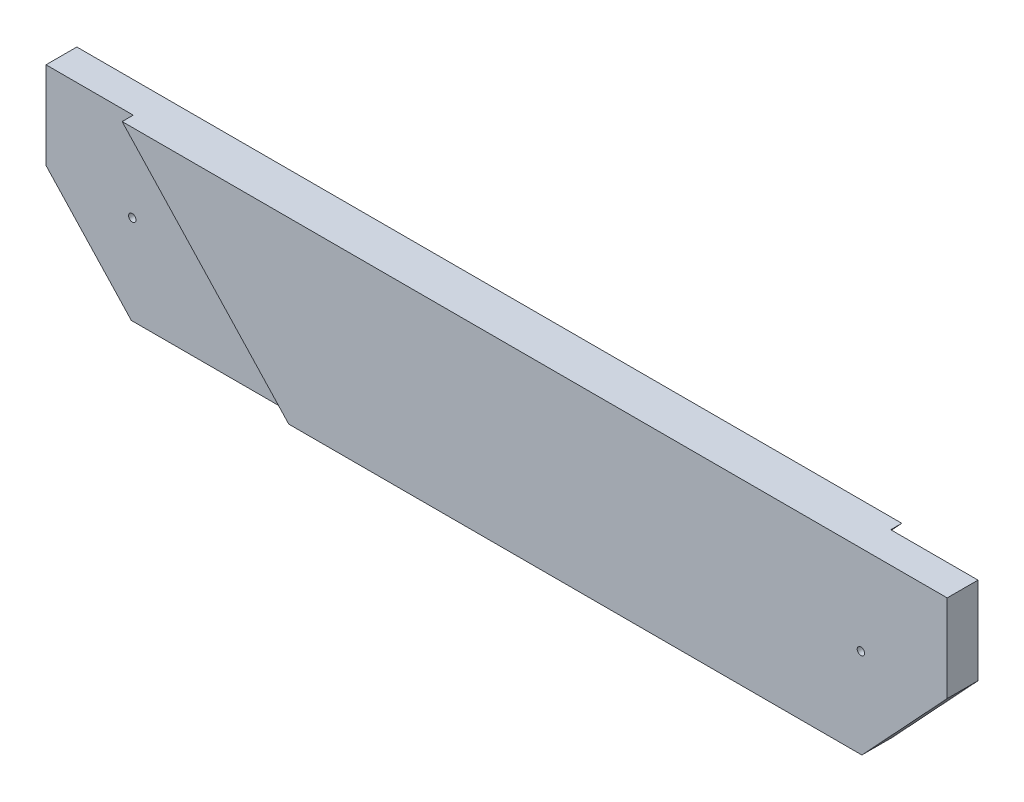
ISO-10303-21;
HEADER;
FILE_DESCRIPTION(('STEP AP214'),'2;1');
FILE_NAME('part.step','',(''),(''),'','','');
FILE_SCHEMA(('AUTOMOTIVE_DESIGN { 1 0 10303 214 1 1 1 1 }'));
ENDSEC;
DATA;
#1=APPLICATION_CONTEXT('core data for automotive mechanical design processes');
#2=APPLICATION_PROTOCOL_DEFINITION('international standard','automotive_design',2000,#1);
#3=PRODUCT_CONTEXT('',#1,'mechanical');
#4=PRODUCT('Part','Part','',(#3));
#5=PRODUCT_RELATED_PRODUCT_CATEGORY('part','',(#4));
#6=PRODUCT_DEFINITION_FORMATION('','',#4);
#7=PRODUCT_DEFINITION_CONTEXT('part definition',#1,'design');
#8=PRODUCT_DEFINITION('design','',#6,#7);
#9=PRODUCT_DEFINITION_SHAPE('','',#8);
#10=(LENGTH_UNIT() NAMED_UNIT(*) SI_UNIT(.MILLI.,.METRE.));
#11=(NAMED_UNIT(*) PLANE_ANGLE_UNIT() SI_UNIT($,.RADIAN.));
#12=(NAMED_UNIT(*) SI_UNIT($,.STERADIAN.) SOLID_ANGLE_UNIT());
#13=UNCERTAINTY_MEASURE_WITH_UNIT(LENGTH_MEASURE(1.E-05),#10,'distance_accuracy_value','');
#14=(GEOMETRIC_REPRESENTATION_CONTEXT(3) GLOBAL_UNCERTAINTY_ASSIGNED_CONTEXT((#13)) GLOBAL_UNIT_ASSIGNED_CONTEXT((#10,
#11,#12)) REPRESENTATION_CONTEXT('',''));
#15=CARTESIAN_POINT('',(0.,0.,0.));
#16=DIRECTION('',(0.,0.,1.));
#17=DIRECTION('',(1.,0.,0.));
#18=AXIS2_PLACEMENT_3D('',#15,#16,#17);
#19=CARTESIAN_POINT('',(370.,72.5,34.));
#20=DIRECTION('',(-1.,0.,0.));
#21=DIRECTION('',(0.,-1.,0.));
#22=AXIS2_PLACEMENT_3D('',#19,#20,#21);
#23=PLANE('',#22);
#24=DIRECTION('',(0.,0.,-1.));
#25=VECTOR('',#24,1.);
#26=CARTESIAN_POINT('',(370.,1.76955905067835,34.));
#27=LINE('',#26,#25);
#28=CARTESIAN_POINT('',(370.,1.76955905067835,34.));
#29=VERTEX_POINT('',#28);
#30=CARTESIAN_POINT('',(370.,1.76955905067835,9.));
#31=VERTEX_POINT('',#30);
#32=EDGE_CURVE('E175',#29,#31,#27,.T.);
#33=ORIENTED_EDGE('',*,*,#32,.T.);
#34=DIRECTION('',(0.,1.,0.));
#35=VECTOR('',#34,1.);
#36=CARTESIAN_POINT('',(370.,72.5,9.));
#37=LINE('',#36,#35);
#38=CARTESIAN_POINT('',(370.,72.5,9.));
#39=VERTEX_POINT('',#38);
#40=EDGE_CURVE('E54',#31,#39,#37,.T.);
#41=ORIENTED_EDGE('',*,*,#40,.T.);
#42=DIRECTION('',(0.,0.,-1.));
#43=VECTOR('',#42,1.);
#44=CARTESIAN_POINT('',(370.,72.5,34.));
#45=LINE('',#44,#43);
#46=CARTESIAN_POINT('',(370.,72.5,34.));
#47=VERTEX_POINT('',#46);
#48=EDGE_CURVE('E154',#47,#39,#45,.T.);
#49=ORIENTED_EDGE('',*,*,#48,.F.);
#50=DIRECTION('',(0.,1.,0.));
#51=VECTOR('',#50,1.);
#52=CARTESIAN_POINT('',(370.,72.5,34.));
#53=LINE('',#52,#51);
#54=EDGE_CURVE('E142',#29,#47,#53,.T.);
#55=ORIENTED_EDGE('',*,*,#54,.F.);
#56=EDGE_LOOP('',(#33,#41,#49,#55));
#57=FACE_BOUND('',#56,.T.);
#58=ADVANCED_FACE('F40',(#57),#23,.F.);
#59=CARTESIAN_POINT('',(-370.,72.5,34.));
#60=DIRECTION('',(0.,-1.,0.));
#61=DIRECTION('',(0.,0.,-1.));
#62=AXIS2_PLACEMENT_3D('',#59,#60,#61);
#63=PLANE('',#62);
#64=DIRECTION('',(-1.,0.,0.));
#65=VECTOR('',#64,1.);
#66=CARTESIAN_POINT('',(-370.,72.5,9.));
#67=LINE('',#66,#65);
#68=CARTESIAN_POINT('',(299.223287792499,72.5,9.));
#69=VERTEX_POINT('',#68);
#70=EDGE_CURVE('E184',#39,#69,#67,.T.);
#71=ORIENTED_EDGE('',*,*,#70,.T.);
#72=DIRECTION('',(0.,0.,-1.));
#73=VECTOR('',#72,1.);
#74=CARTESIAN_POINT('',(299.223287792499,72.5,34.));
#75=LINE('',#74,#73);
#76=CARTESIAN_POINT('',(299.223287792499,72.5,0.));
#77=VERTEX_POINT('',#76);
#78=EDGE_CURVE('E125',#69,#77,#75,.T.);
#79=ORIENTED_EDGE('',*,*,#78,.T.);
#80=DIRECTION('',(-1.,0.,0.));
#81=VECTOR('',#80,1.);
#82=CARTESIAN_POINT('',(-370.,72.5,0.));
#83=LINE('',#82,#81);
#84=CARTESIAN_POINT('',(-370.,72.5,0.));
#85=VERTEX_POINT('',#84);
#86=EDGE_CURVE('E135',#77,#85,#83,.T.);
#87=ORIENTED_EDGE('',*,*,#86,.T.);
#88=DIRECTION('',(0.,0.,-1.));
#89=VECTOR('',#88,1.);
#90=CARTESIAN_POINT('',(-370.,72.5,34.));
#91=LINE('',#90,#89);
#92=CARTESIAN_POINT('',(-370.,72.5,25.));
#93=VERTEX_POINT('',#92);
#94=EDGE_CURVE('E151',#93,#85,#91,.T.);
#95=ORIENTED_EDGE('',*,*,#94,.F.);
#96=DIRECTION('',(1.,0.,0.));
#97=VECTOR('',#96,1.);
#98=CARTESIAN_POINT('',(-370.,72.5,25.));
#99=LINE('',#98,#97);
#100=CARTESIAN_POINT('',(-299.223287792498,72.5,25.));
#101=VERTEX_POINT('',#100);
#102=EDGE_CURVE('E196',#93,#101,#99,.T.);
#103=ORIENTED_EDGE('',*,*,#102,.T.);
#104=DIRECTION('',(0.,0.,1.));
#105=VECTOR('',#104,1.);
#106=CARTESIAN_POINT('',(-299.223287792498,72.5,34.));
#107=LINE('',#106,#105);
#108=CARTESIAN_POINT('',(-299.223287792498,72.5,34.));
#109=VERTEX_POINT('',#108);
#110=EDGE_CURVE('E168',#101,#109,#107,.T.);
#111=ORIENTED_EDGE('',*,*,#110,.T.);
#112=DIRECTION('',(-1.,0.,0.));
#113=VECTOR('',#112,1.);
#114=CARTESIAN_POINT('',(-370.,72.5,34.));
#115=LINE('',#114,#113);
#116=EDGE_CURVE('E145',#47,#109,#115,.T.);
#117=ORIENTED_EDGE('',*,*,#116,.F.);
#118=ORIENTED_EDGE('',*,*,#48,.T.);
#119=EDGE_LOOP('',(#71,#79,#87,#95,#103,#111,#117,#118));
#120=FACE_BOUND('',#119,.T.);
#121=ADVANCED_FACE('F182',(#120),#63,.F.);
#122=CARTESIAN_POINT('',(-370.,72.5,34.));
#123=DIRECTION('',(1.,0.,0.));
#124=DIRECTION('',(0.,0.,-1.));
#125=AXIS2_PLACEMENT_3D('',#122,#123,#124);
#126=PLANE('',#125);
#127=DIRECTION('',(0.,0.,-1.));
#128=VECTOR('',#127,1.);
#129=CARTESIAN_POINT('',(-370.,1.76955905067837,34.));
#130=LINE('',#129,#128);
#131=CARTESIAN_POINT('',(-370.,1.76955905067837,25.));
#132=VERTEX_POINT('',#131);
#133=CARTESIAN_POINT('',(-370.,1.76955905067837,0.));
#134=VERTEX_POINT('',#133);
#135=EDGE_CURVE('E160',#132,#134,#130,.T.);
#136=ORIENTED_EDGE('',*,*,#135,.F.);
#137=DIRECTION('',(0.,1.,0.));
#138=VECTOR('',#137,1.);
#139=CARTESIAN_POINT('',(-370.,72.5,25.));
#140=LINE('',#139,#138);
#141=EDGE_CURVE('E61',#132,#93,#140,.T.);
#142=ORIENTED_EDGE('',*,*,#141,.T.);
#143=ORIENTED_EDGE('',*,*,#94,.T.);
#144=DIRECTION('',(0.,-1.,0.));
#145=VECTOR('',#144,1.);
#146=CARTESIAN_POINT('',(-370.,72.5,0.));
#147=LINE('',#146,#145);
#148=EDGE_CURVE('E143',#85,#134,#147,.T.);
#149=ORIENTED_EDGE('',*,*,#148,.T.);
#150=EDGE_LOOP('',(#136,#142,#143,#149));
#151=FACE_BOUND('',#150,.T.);
#152=ADVANCED_FACE('F162',(#151),#126,.F.);
#153=CARTESIAN_POINT('',(-370.,-72.5,34.));
#154=DIRECTION('',(0.,1.,0.));
#155=DIRECTION('',(0.,0.,1.));
#156=AXIS2_PLACEMENT_3D('',#153,#154,#155);
#157=PLANE('',#156);
#158=DIRECTION('',(1.,0.,0.));
#159=VECTOR('',#158,1.);
#160=CARTESIAN_POINT('',(-370.,-72.5,0.));
#161=LINE('',#160,#159);
#162=CARTESIAN_POINT('',(-300.776712207501,-72.5,0.));
#163=VERTEX_POINT('',#162);
#164=CARTESIAN_POINT('',(164.075363687237,-72.5,0.));
#165=VERTEX_POINT('',#164);
#166=EDGE_CURVE('E133',#163,#165,#161,.T.);
#167=ORIENTED_EDGE('',*,*,#166,.T.);
#168=DIRECTION('',(0.,0.,1.));
#169=VECTOR('',#168,1.);
#170=CARTESIAN_POINT('',(164.075363687238,-72.5,34.));
#171=LINE('',#170,#169);
#172=CARTESIAN_POINT('',(164.075363687237,-72.5,9.));
#173=VERTEX_POINT('',#172);
#174=EDGE_CURVE('E115',#165,#173,#171,.T.);
#175=ORIENTED_EDGE('',*,*,#174,.T.);
#176=DIRECTION('',(1.,0.,0.));
#177=VECTOR('',#176,1.);
#178=CARTESIAN_POINT('',(-370.,-72.5,9.));
#179=LINE('',#178,#177);
#180=CARTESIAN_POINT('',(300.776712207502,-72.5,9.));
#181=VERTEX_POINT('',#180);
#182=EDGE_CURVE('E217',#173,#181,#179,.T.);
#183=ORIENTED_EDGE('',*,*,#182,.T.);
#184=DIRECTION('',(0.,0.,-1.));
#185=VECTOR('',#184,1.);
#186=CARTESIAN_POINT('',(300.776712207502,-72.5,34.));
#187=LINE('',#186,#185);
#188=CARTESIAN_POINT('',(300.776712207502,-72.5,34.));
#189=VERTEX_POINT('',#188);
#190=EDGE_CURVE('E208',#189,#181,#187,.T.);
#191=ORIENTED_EDGE('',*,*,#190,.F.);
#192=DIRECTION('',(1.,0.,0.));
#193=VECTOR('',#192,1.);
#194=CARTESIAN_POINT('',(-370.,-72.5,34.));
#195=LINE('',#194,#193);
#196=CARTESIAN_POINT('',(-164.075363687237,-72.5,34.));
#197=VERTEX_POINT('',#196);
#198=EDGE_CURVE('E155',#197,#189,#195,.T.);
#199=ORIENTED_EDGE('',*,*,#198,.F.);
#200=DIRECTION('',(0.,0.,-1.));
#201=VECTOR('',#200,1.);
#202=CARTESIAN_POINT('',(-164.075363687237,-72.5,34.));
#203=LINE('',#202,#201);
#204=CARTESIAN_POINT('',(-164.075363687237,-72.5,25.));
#205=VERTEX_POINT('',#204);
#206=EDGE_CURVE('E201',#197,#205,#203,.T.);
#207=ORIENTED_EDGE('',*,*,#206,.T.);
#208=DIRECTION('',(-1.,0.,0.));
#209=VECTOR('',#208,1.);
#210=CARTESIAN_POINT('',(-370.,-72.5,25.));
#211=LINE('',#210,#209);
#212=CARTESIAN_POINT('',(-300.776712207501,-72.5,25.));
#213=VERTEX_POINT('',#212);
#214=EDGE_CURVE('E192',#205,#213,#211,.T.);
#215=ORIENTED_EDGE('',*,*,#214,.T.);
#216=DIRECTION('',(0.,0.,-1.));
#217=VECTOR('',#216,1.);
#218=CARTESIAN_POINT('',(-300.776712207501,-72.5,34.));
#219=LINE('',#218,#217);
#220=EDGE_CURVE('E140',#213,#163,#219,.T.);
#221=ORIENTED_EDGE('',*,*,#220,.T.);
#222=EDGE_LOOP('',(#167,#175,#183,#191,#199,#207,#215,#221));
#223=FACE_BOUND('',#222,.T.);
#224=ADVANCED_FACE('F137',(#223),#157,.F.);
#225=CARTESIAN_POINT('',(0.,0.,34.));
#226=DIRECTION('',(0.,0.,1.));
#227=DIRECTION('',(1.,0.,0.));
#228=AXIS2_PLACEMENT_3D('',#225,#226,#227);
#229=PLANE('',#228);
#230=DIRECTION('',(-0.681818181818182,0.731521679065049,0.));
#231=VECTOR('',#230,1.);
#232=CARTESIAN_POINT('',(-337.944791383867,114.044241673852,34.));
#233=LINE('',#232,#231);
#234=EDGE_CURVE('E185',#197,#109,#233,.T.);
#235=ORIENTED_EDGE('',*,*,#234,.F.);
#236=ORIENTED_EDGE('',*,*,#198,.T.);
#237=DIRECTION('',(0.681818181818182,0.731521679065049,0.));
#238=VECTOR('',#237,1.);
#239=CARTESIAN_POINT('',(370.,1.76955905067835,34.));
#240=LINE('',#239,#238);
#241=EDGE_CURVE('E166',#189,#29,#240,.T.);
#242=ORIENTED_EDGE('',*,*,#241,.T.);
#243=ORIENTED_EDGE('',*,*,#54,.T.);
#244=ORIENTED_EDGE('',*,*,#116,.T.);
#245=EDGE_LOOP('',(#235,#236,#242,#243,#244));
#246=FACE_BOUND('',#245,.T.);
#247=CARTESIAN_POINT('',(300.,0.,34.));
#248=DIRECTION('',(0.,0.,-1.));
#249=DIRECTION('',(-1.,0.,0.));
#250=AXIS2_PLACEMENT_3D('',#247,#248,#249);
#251=CIRCLE('',#250,2.99999999999999);
#252=CARTESIAN_POINT('',(297.,0.,34.));
#253=VERTEX_POINT('',#252);
#254=EDGE_CURVE('E171',#253,#253,#251,.T.);
#255=ORIENTED_EDGE('',*,*,#254,.T.);
#256=EDGE_LOOP('',(#255));
#257=FACE_BOUND('',#256,.T.);
#258=ADVANCED_FACE('F234',(#246,#257),#229,.T.);
#259=CARTESIAN_POINT('',(0.,0.,0.));
#260=DIRECTION('',(0.,0.,1.));
#261=DIRECTION('',(1.,0.,0.));
#262=AXIS2_PLACEMENT_3D('',#259,#260,#261);
#263=PLANE('',#262);
#264=CARTESIAN_POINT('',(-300.,0.,0.));
#265=DIRECTION('',(0.,0.,1.));
#266=DIRECTION('',(1.,0.,0.));
#267=AXIS2_PLACEMENT_3D('',#264,#265,#266);
#268=CIRCLE('',#267,2.99999999999999);
#269=CARTESIAN_POINT('',(-297.,0.,0.));
#270=VERTEX_POINT('',#269);
#271=EDGE_CURVE('E174',#270,#270,#268,.T.);
#272=ORIENTED_EDGE('',*,*,#271,.T.);
#273=EDGE_LOOP('',(#272));
#274=FACE_BOUND('',#273,.T.);
#275=ORIENTED_EDGE('',*,*,#86,.F.);
#276=DIRECTION('',(0.681818181818182,0.731521679065049,0.));
#277=VECTOR('',#276,1.);
#278=CARTESIAN_POINT('',(361.833214072471,139.674093651081,0.));
#279=LINE('',#278,#277);
#280=EDGE_CURVE('E118',#165,#77,#279,.T.);
#281=ORIENTED_EDGE('',*,*,#280,.F.);
#282=ORIENTED_EDGE('',*,*,#166,.F.);
#283=DIRECTION('',(0.681818181818181,-0.73152167906505,0.));
#284=VECTOR('',#283,1.);
#285=CARTESIAN_POINT('',(-300.776712207501,-72.5,0.));
#286=LINE('',#285,#284);
#287=EDGE_CURVE('E164',#134,#163,#286,.T.);
#288=ORIENTED_EDGE('',*,*,#287,.F.);
#289=ORIENTED_EDGE('',*,*,#148,.F.);
#290=EDGE_LOOP('',(#275,#281,#282,#288,#289));
#291=FACE_BOUND('',#290,.T.);
#292=ADVANCED_FACE('F131',(#274,#291),#263,.F.);
#293=CARTESIAN_POINT('',(-300.,0.,0.));
#294=DIRECTION('',(0.,0.,1.));
#295=DIRECTION('',(1.,0.,0.));
#296=AXIS2_PLACEMENT_3D('',#293,#294,#295);
#297=CYLINDRICAL_SURFACE('',#296,2.99999999999999);
#298=CARTESIAN_POINT('',(-300.,0.,25.));
#299=DIRECTION('',(0.,0.,-1.));
#300=DIRECTION('',(-1.,0.,0.));
#301=AXIS2_PLACEMENT_3D('',#298,#299,#300);
#302=CIRCLE('',#301,2.99999999999999);
#303=CARTESIAN_POINT('',(-303.,0.,25.));
#304=VERTEX_POINT('',#303);
#305=EDGE_CURVE('E198',#304,#304,#302,.F.);
#306=ORIENTED_EDGE('',*,*,#305,.T.);
#307=EDGE_LOOP('',(#306));
#308=FACE_BOUND('',#307,.T.);
#309=ORIENTED_EDGE('',*,*,#271,.F.);
#310=EDGE_LOOP('',(#309));
#311=FACE_BOUND('',#310,.T.);
#312=ADVANCED_FACE('F230',(#308,#311),#297,.F.);
#313=CARTESIAN_POINT('',(300.,0.,0.));
#314=DIRECTION('',(0.,0.,1.));
#315=DIRECTION('',(1.,0.,0.));
#316=AXIS2_PLACEMENT_3D('',#313,#314,#315);
#317=CYLINDRICAL_SURFACE('',#316,2.99999999999999);
#318=CARTESIAN_POINT('',(300.,0.,9.));
#319=DIRECTION('',(0.,0.,1.));
#320=DIRECTION('',(1.,0.,0.));
#321=AXIS2_PLACEMENT_3D('',#318,#319,#320);
#322=CIRCLE('',#321,2.99999999999999);
#323=CARTESIAN_POINT('',(303.,0.,9.));
#324=VERTEX_POINT('',#323);
#325=EDGE_CURVE('E126',#324,#324,#322,.T.);
#326=ORIENTED_EDGE('',*,*,#325,.F.);
#327=EDGE_LOOP('',(#326));
#328=FACE_BOUND('',#327,.T.);
#329=ORIENTED_EDGE('',*,*,#254,.F.);
#330=EDGE_LOOP('',(#329));
#331=FACE_BOUND('',#330,.T.);
#332=ADVANCED_FACE('F227',(#328,#331),#317,.F.);
#333=CARTESIAN_POINT('',(-300.776712207501,-72.5,34.));
#334=DIRECTION('',(0.73152167906505,0.681818181818181,0.));
#335=DIRECTION('',(-0.681818181818181,0.73152167906505,0.));
#336=AXIS2_PLACEMENT_3D('',#333,#334,#335);
#337=PLANE('',#336);
#338=ORIENTED_EDGE('',*,*,#220,.F.);
#339=DIRECTION('',(-0.681818181818181,0.73152167906505,0.));
#340=VECTOR('',#339,1.);
#341=CARTESIAN_POINT('',(-300.776712207501,-72.5,25.));
#342=LINE('',#341,#340);
#343=EDGE_CURVE('E47',#213,#132,#342,.T.);
#344=ORIENTED_EDGE('',*,*,#343,.T.);
#345=ORIENTED_EDGE('',*,*,#135,.T.);
#346=ORIENTED_EDGE('',*,*,#287,.T.);
#347=EDGE_LOOP('',(#338,#344,#345,#346));
#348=FACE_BOUND('',#347,.T.);
#349=ADVANCED_FACE('F159',(#348),#337,.F.);
#350=CARTESIAN_POINT('',(370.,1.76955905067835,34.));
#351=DIRECTION('',(-0.731521679065049,0.681818181818182,0.));
#352=DIRECTION('',(-0.681818181818182,-0.731521679065049,0.));
#353=AXIS2_PLACEMENT_3D('',#350,#351,#352);
#354=PLANE('',#353);
#355=ORIENTED_EDGE('',*,*,#190,.T.);
#356=DIRECTION('',(0.681818181818182,0.731521679065049,0.));
#357=VECTOR('',#356,1.);
#358=CARTESIAN_POINT('',(370.,1.76955905067835,9.));
#359=LINE('',#358,#357);
#360=EDGE_CURVE('E11',#181,#31,#359,.T.);
#361=ORIENTED_EDGE('',*,*,#360,.T.);
#362=ORIENTED_EDGE('',*,*,#32,.F.);
#363=ORIENTED_EDGE('',*,*,#241,.F.);
#364=EDGE_LOOP('',(#355,#361,#362,#363));
#365=FACE_BOUND('',#364,.T.);
#366=ADVANCED_FACE('F215',(#365),#354,.F.);
#367=CARTESIAN_POINT('',(-337.944791383867,114.044241673852,25.));
#368=DIRECTION('',(0.731521679065049,0.681818181818182,0.));
#369=DIRECTION('',(-0.681818181818182,0.731521679065049,0.));
#370=AXIS2_PLACEMENT_3D('',#367,#368,#369);
#371=PLANE('',#370);
#372=DIRECTION('',(-0.681818181818182,0.731521679065049,0.));
#373=VECTOR('',#372,1.);
#374=CARTESIAN_POINT('',(-337.944791383867,114.044241673852,25.));
#375=LINE('',#374,#373);
#376=EDGE_CURVE('E187',#205,#101,#375,.T.);
#377=ORIENTED_EDGE('',*,*,#376,.F.);
#378=ORIENTED_EDGE('',*,*,#206,.F.);
#379=ORIENTED_EDGE('',*,*,#234,.T.);
#380=ORIENTED_EDGE('',*,*,#110,.F.);
#381=EDGE_LOOP('',(#377,#378,#379,#380));
#382=FACE_BOUND('',#381,.T.);
#383=ADVANCED_FACE('F260',(#382),#371,.F.);
#384=CARTESIAN_POINT('',(0.,0.,25.));
#385=DIRECTION('',(0.,0.,-1.));
#386=DIRECTION('',(-1.,0.,0.));
#387=AXIS2_PLACEMENT_3D('',#384,#385,#386);
#388=PLANE('',#387);
#389=ORIENTED_EDGE('',*,*,#141,.F.);
#390=ORIENTED_EDGE('',*,*,#343,.F.);
#391=ORIENTED_EDGE('',*,*,#214,.F.);
#392=ORIENTED_EDGE('',*,*,#376,.T.);
#393=ORIENTED_EDGE('',*,*,#102,.F.);
#394=EDGE_LOOP('',(#389,#390,#391,#392,#393));
#395=FACE_BOUND('',#394,.T.);
#396=ORIENTED_EDGE('',*,*,#305,.F.);
#397=EDGE_LOOP('',(#396));
#398=FACE_BOUND('',#397,.T.);
#399=ADVANCED_FACE('F261',(#395,#398),#388,.F.);
#400=CARTESIAN_POINT('',(361.833214072471,139.674093651081,9.));
#401=DIRECTION('',(-0.731521679065049,0.681818181818182,0.));
#402=DIRECTION('',(-0.681818181818182,-0.731521679065049,0.));
#403=AXIS2_PLACEMENT_3D('',#400,#401,#402);
#404=PLANE('',#403);
#405=DIRECTION('',(0.681818181818182,0.731521679065049,0.));
#406=VECTOR('',#405,1.);
#407=CARTESIAN_POINT('',(361.833214072471,139.674093651081,9.));
#408=LINE('',#407,#406);
#409=EDGE_CURVE('E121',#173,#69,#408,.T.);
#410=ORIENTED_EDGE('',*,*,#409,.F.);
#411=ORIENTED_EDGE('',*,*,#174,.F.);
#412=ORIENTED_EDGE('',*,*,#280,.T.);
#413=ORIENTED_EDGE('',*,*,#78,.F.);
#414=EDGE_LOOP('',(#410,#411,#412,#413));
#415=FACE_BOUND('',#414,.T.);
#416=ADVANCED_FACE('F117',(#415),#404,.F.);
#417=CARTESIAN_POINT('',(0.,0.,9.));
#418=DIRECTION('',(0.,0.,1.));
#419=DIRECTION('',(1.,0.,0.));
#420=AXIS2_PLACEMENT_3D('',#417,#418,#419);
#421=PLANE('',#420);
#422=ORIENTED_EDGE('',*,*,#325,.T.);
#423=EDGE_LOOP('',(#422));
#424=FACE_BOUND('',#423,.T.);
#425=ORIENTED_EDGE('',*,*,#40,.F.);
#426=ORIENTED_EDGE('',*,*,#360,.F.);
#427=ORIENTED_EDGE('',*,*,#182,.F.);
#428=ORIENTED_EDGE('',*,*,#409,.T.);
#429=ORIENTED_EDGE('',*,*,#70,.F.);
#430=EDGE_LOOP('',(#425,#426,#427,#428,#429));
#431=FACE_BOUND('',#430,.T.);
#432=ADVANCED_FACE('F225',(#424,#431),#421,.F.);
#433=CLOSED_SHELL('',(#58,#121,#152,#224,#258,#292,#312,#332,#349,#366,#383,#399,#416,#432));
#434=MANIFOLD_SOLID_BREP('B2',#433);
#435=ADVANCED_BREP_SHAPE_REPRESENTATION('',(#18,#434),#14);
#436=SHAPE_DEFINITION_REPRESENTATION(#9,#435);
ENDSEC;
END-ISO-10303-21;
